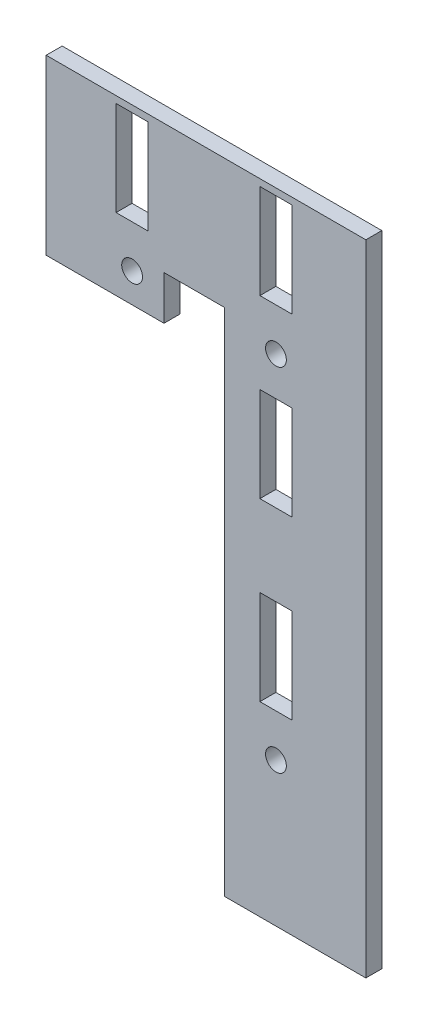
ISO-10303-21;
HEADER;
FILE_DESCRIPTION(('STEP AP214'),'2;1');
FILE_NAME('part.step','',(''),(''),'','','');
FILE_SCHEMA(('AUTOMOTIVE_DESIGN { 1 0 10303 214 1 1 1 1 }'));
ENDSEC;
DATA;
#1=APPLICATION_CONTEXT('core data for automotive mechanical design processes');
#2=APPLICATION_PROTOCOL_DEFINITION('international standard','automotive_design',2000,#1);
#3=PRODUCT_CONTEXT('',#1,'mechanical');
#4=PRODUCT('Part','Part','',(#3));
#5=PRODUCT_RELATED_PRODUCT_CATEGORY('part','',(#4));
#6=PRODUCT_DEFINITION_FORMATION('','',#4);
#7=PRODUCT_DEFINITION_CONTEXT('part definition',#1,'design');
#8=PRODUCT_DEFINITION('design','',#6,#7);
#9=PRODUCT_DEFINITION_SHAPE('','',#8);
#10=(LENGTH_UNIT() NAMED_UNIT(*) SI_UNIT(.MILLI.,.METRE.));
#11=(NAMED_UNIT(*) PLANE_ANGLE_UNIT() SI_UNIT($,.RADIAN.));
#12=(NAMED_UNIT(*) SI_UNIT($,.STERADIAN.) SOLID_ANGLE_UNIT());
#13=UNCERTAINTY_MEASURE_WITH_UNIT(LENGTH_MEASURE(1.E-05),#10,'distance_accuracy_value','');
#14=(GEOMETRIC_REPRESENTATION_CONTEXT(3) GLOBAL_UNCERTAINTY_ASSIGNED_CONTEXT((#13)) GLOBAL_UNIT_ASSIGNED_CONTEXT((#10,
#11,#12)) REPRESENTATION_CONTEXT('',''));
#15=CARTESIAN_POINT('',(0.,0.,0.));
#16=DIRECTION('',(0.,0.,1.));
#17=DIRECTION('',(1.,0.,0.));
#18=AXIS2_PLACEMENT_3D('',#15,#16,#17);
#19=CARTESIAN_POINT('',(-25.4,50.8,2.54));
#20=DIRECTION('',(0.,-1.,0.));
#21=DIRECTION('',(1.,0.,0.));
#22=AXIS2_PLACEMENT_3D('',#19,#20,#21);
#23=PLANE('',#22);
#24=DIRECTION('',(-1.,0.,0.));
#25=VECTOR('',#24,1.);
#26=CARTESIAN_POINT('',(-25.4,50.8,0.));
#27=LINE('',#26,#25);
#28=CARTESIAN_POINT('',(25.4,50.8,0.));
#29=VERTEX_POINT('',#28);
#30=CARTESIAN_POINT('',(-25.4,50.8,0.));
#31=VERTEX_POINT('',#30);
#32=EDGE_CURVE('E228',#29,#31,#27,.T.);
#33=ORIENTED_EDGE('',*,*,#32,.T.);
#34=DIRECTION('',(0.,0.,-1.));
#35=VECTOR('',#34,1.);
#36=CARTESIAN_POINT('',(-25.4,50.8,2.54));
#37=LINE('',#36,#35);
#38=CARTESIAN_POINT('',(-25.4,50.8,2.54));
#39=VERTEX_POINT('',#38);
#40=EDGE_CURVE('E11',#39,#31,#37,.T.);
#41=ORIENTED_EDGE('',*,*,#40,.F.);
#42=DIRECTION('',(-1.,0.,0.));
#43=VECTOR('',#42,1.);
#44=CARTESIAN_POINT('',(-25.4,50.8,2.54));
#45=LINE('',#44,#43);
#46=CARTESIAN_POINT('',(25.4,50.8,2.54));
#47=VERTEX_POINT('',#46);
#48=EDGE_CURVE('E225',#47,#39,#45,.T.);
#49=ORIENTED_EDGE('',*,*,#48,.F.);
#50=DIRECTION('',(0.,0.,-1.));
#51=VECTOR('',#50,1.);
#52=CARTESIAN_POINT('',(25.4,50.8,2.54));
#53=LINE('',#52,#51);
#54=EDGE_CURVE('E232',#47,#29,#53,.T.);
#55=ORIENTED_EDGE('',*,*,#54,.T.);
#56=EDGE_LOOP('',(#33,#41,#49,#55));
#57=FACE_BOUND('',#56,.T.);
#58=ADVANCED_FACE('F39',(#57),#23,.F.);
#59=CARTESIAN_POINT('',(-25.4,-50.8,2.54));
#60=DIRECTION('',(1.,0.,0.));
#61=DIRECTION('',(0.,0.,-1.));
#62=AXIS2_PLACEMENT_3D('',#59,#60,#61);
#63=PLANE('',#62);
#64=DIRECTION('',(0.,-1.,0.));
#65=VECTOR('',#64,1.);
#66=CARTESIAN_POINT('',(-25.4,-50.8,0.));
#67=LINE('',#66,#65);
#68=CARTESIAN_POINT('',(-25.4,23.27,0.));
#69=VERTEX_POINT('',#68);
#70=EDGE_CURVE('E223',#31,#69,#67,.T.);
#71=ORIENTED_EDGE('',*,*,#70,.T.);
#72=DIRECTION('',(0.,0.,1.));
#73=VECTOR('',#72,1.);
#74=CARTESIAN_POINT('',(-25.4,23.27,0.));
#75=LINE('',#74,#73);
#76=CARTESIAN_POINT('',(-25.4,23.27,2.54));
#77=VERTEX_POINT('',#76);
#78=EDGE_CURVE('E270',#69,#77,#75,.T.);
#79=ORIENTED_EDGE('',*,*,#78,.T.);
#80=DIRECTION('',(0.,-1.,0.));
#81=VECTOR('',#80,1.);
#82=CARTESIAN_POINT('',(-25.4,-50.8,2.54));
#83=LINE('',#82,#81);
#84=EDGE_CURVE('E243',#39,#77,#83,.T.);
#85=ORIENTED_EDGE('',*,*,#84,.F.);
#86=ORIENTED_EDGE('',*,*,#40,.T.);
#87=EDGE_LOOP('',(#71,#79,#85,#86));
#88=FACE_BOUND('',#87,.T.);
#89=ADVANCED_FACE('F269',(#88),#63,.F.);
#90=CARTESIAN_POINT('',(-25.4,-50.8,2.54));
#91=DIRECTION('',(0.,1.,0.));
#92=DIRECTION('',(-1.,0.,0.));
#93=AXIS2_PLACEMENT_3D('',#90,#91,#92);
#94=PLANE('',#93);
#95=DIRECTION('',(1.,0.,0.));
#96=VECTOR('',#95,1.);
#97=CARTESIAN_POINT('',(-25.4,-50.8,2.54));
#98=LINE('',#97,#96);
#99=CARTESIAN_POINT('',(2.97790303354134,-50.8,2.54));
#100=VERTEX_POINT('',#99);
#101=CARTESIAN_POINT('',(25.4,-50.8,2.54));
#102=VERTEX_POINT('',#101);
#103=EDGE_CURVE('E215',#100,#102,#98,.T.);
#104=ORIENTED_EDGE('',*,*,#103,.F.);
#105=DIRECTION('',(0.,0.,1.));
#106=VECTOR('',#105,1.);
#107=CARTESIAN_POINT('',(2.97790303354134,-50.8,0.));
#108=LINE('',#107,#106);
#109=CARTESIAN_POINT('',(2.97790303354134,-50.8,0.));
#110=VERTEX_POINT('',#109);
#111=EDGE_CURVE('E202',#110,#100,#108,.T.);
#112=ORIENTED_EDGE('',*,*,#111,.F.);
#113=DIRECTION('',(1.,0.,0.));
#114=VECTOR('',#113,1.);
#115=CARTESIAN_POINT('',(-25.4,-50.8,0.));
#116=LINE('',#115,#114);
#117=CARTESIAN_POINT('',(25.4,-50.8,0.));
#118=VERTEX_POINT('',#117);
#119=EDGE_CURVE('E213',#110,#118,#116,.T.);
#120=ORIENTED_EDGE('',*,*,#119,.T.);
#121=DIRECTION('',(0.,0.,-1.));
#122=VECTOR('',#121,1.);
#123=CARTESIAN_POINT('',(25.4,-50.8,2.54));
#124=LINE('',#123,#122);
#125=EDGE_CURVE('E46',#102,#118,#124,.T.);
#126=ORIENTED_EDGE('',*,*,#125,.F.);
#127=EDGE_LOOP('',(#104,#112,#120,#126));
#128=FACE_BOUND('',#127,.T.);
#129=ADVANCED_FACE('F211',(#128),#94,.F.);
#130=CARTESIAN_POINT('',(25.4,-50.8,2.54));
#131=DIRECTION('',(-1.,0.,0.));
#132=DIRECTION('',(0.,0.,1.));
#133=AXIS2_PLACEMENT_3D('',#130,#131,#132);
#134=PLANE('',#133);
#135=DIRECTION('',(0.,1.,0.));
#136=VECTOR('',#135,1.);
#137=CARTESIAN_POINT('',(25.4,-50.8,0.));
#138=LINE('',#137,#136);
#139=EDGE_CURVE('E222',#118,#29,#138,.T.);
#140=ORIENTED_EDGE('',*,*,#139,.T.);
#141=ORIENTED_EDGE('',*,*,#54,.F.);
#142=DIRECTION('',(0.,1.,0.));
#143=VECTOR('',#142,1.);
#144=CARTESIAN_POINT('',(25.4,-50.8,2.54));
#145=LINE('',#144,#143);
#146=EDGE_CURVE('E234',#102,#47,#145,.T.);
#147=ORIENTED_EDGE('',*,*,#146,.F.);
#148=ORIENTED_EDGE('',*,*,#125,.T.);
#149=EDGE_LOOP('',(#140,#141,#147,#148));
#150=FACE_BOUND('',#149,.T.);
#151=ADVANCED_FACE('F237',(#150),#134,.F.);
#152=CARTESIAN_POINT('',(0.,0.,2.54));
#153=DIRECTION('',(0.,0.,1.));
#154=DIRECTION('',(1.,0.,0.));
#155=AXIS2_PLACEMENT_3D('',#152,#153,#154);
#156=PLANE('',#155);
#157=DIRECTION('',(-1.,0.,0.));
#158=VECTOR('',#157,1.);
#159=CARTESIAN_POINT('',(-6.67409696645865,23.27,2.54));
#160=LINE('',#159,#158);
#161=CARTESIAN_POINT('',(-6.67409696645865,23.27,2.54));
#162=VERTEX_POINT('',#161);
#163=EDGE_CURVE('E207',#162,#77,#160,.T.);
#164=ORIENTED_EDGE('',*,*,#163,.F.);
#165=DIRECTION('',(0.,-1.,0.));
#166=VECTOR('',#165,1.);
#167=CARTESIAN_POINT('',(-6.67409696645865,30.255,2.54));
#168=LINE('',#167,#166);
#169=CARTESIAN_POINT('',(-6.67409696645865,30.255,2.54));
#170=VERTEX_POINT('',#169);
#171=EDGE_CURVE('E670',#170,#162,#168,.T.);
#172=ORIENTED_EDGE('',*,*,#171,.F.);
#173=DIRECTION('',(-1.,0.,0.));
#174=VECTOR('',#173,1.);
#175=CARTESIAN_POINT('',(2.97790303354134,30.255,2.54));
#176=LINE('',#175,#174);
#177=CARTESIAN_POINT('',(2.97790303354134,30.255,2.54));
#178=VERTEX_POINT('',#177);
#179=EDGE_CURVE('E668',#178,#170,#176,.T.);
#180=ORIENTED_EDGE('',*,*,#179,.F.);
#181=DIRECTION('',(0.,1.,0.));
#182=VECTOR('',#181,1.);
#183=CARTESIAN_POINT('',(2.97790303354134,-50.8,2.54));
#184=LINE('',#183,#182);
#185=EDGE_CURVE('E671',#100,#178,#184,.T.);
#186=ORIENTED_EDGE('',*,*,#185,.F.);
#187=ORIENTED_EDGE('',*,*,#103,.T.);
#188=ORIENTED_EDGE('',*,*,#146,.T.);
#189=ORIENTED_EDGE('',*,*,#48,.T.);
#190=ORIENTED_EDGE('',*,*,#84,.T.);
#191=EDGE_LOOP('',(#164,#172,#180,#186,#187,#188,#189,#190));
#192=FACE_BOUND('',#191,.T.);
#193=DIRECTION('',(0.,-1.,0.));
#194=VECTOR('',#193,1.);
#195=CARTESIAN_POINT('',(8.56590303354135,-6.16000000000001,2.54));
#196=LINE('',#195,#194);
#197=CARTESIAN_POINT('',(8.56590303354135,-6.16000000000001,2.54));
#198=VERTEX_POINT('',#197);
#199=CARTESIAN_POINT('',(8.56590303354135,-21.18,2.54));
#200=VERTEX_POINT('',#199);
#201=EDGE_CURVE('E61',#198,#200,#196,.T.);
#202=ORIENTED_EDGE('',*,*,#201,.F.);
#203=DIRECTION('',(-1.,0.,0.));
#204=VECTOR('',#203,1.);
#205=CARTESIAN_POINT('',(13.6659030335413,-6.16000000000001,2.54));
#206=LINE('',#205,#204);
#207=CARTESIAN_POINT('',(13.6659030335413,-6.16000000000001,2.54));
#208=VERTEX_POINT('',#207);
#209=EDGE_CURVE('E290',#208,#198,#206,.T.);
#210=ORIENTED_EDGE('',*,*,#209,.F.);
#211=DIRECTION('',(0.,1.,0.));
#212=VECTOR('',#211,1.);
#213=CARTESIAN_POINT('',(13.6659030335413,-6.16000000000001,2.54));
#214=LINE('',#213,#212);
#215=CARTESIAN_POINT('',(13.6659030335413,-21.18,2.54));
#216=VERTEX_POINT('',#215);
#217=EDGE_CURVE('E305',#216,#208,#214,.T.);
#218=ORIENTED_EDGE('',*,*,#217,.F.);
#219=DIRECTION('',(1.,0.,0.));
#220=VECTOR('',#219,1.);
#221=CARTESIAN_POINT('',(13.6659030335413,-21.18,2.54));
#222=LINE('',#221,#220);
#223=EDGE_CURVE('E301',#200,#216,#222,.T.);
#224=ORIENTED_EDGE('',*,*,#223,.F.);
#225=EDGE_LOOP('',(#202,#210,#218,#224));
#226=FACE_BOUND('',#225,.T.);
#227=DIRECTION('',(0.,1.,0.));
#228=VECTOR('',#227,1.);
#229=CARTESIAN_POINT('',(13.6659030335413,34.7,2.54));
#230=LINE('',#229,#228);
#231=CARTESIAN_POINT('',(13.6659030335413,34.7,2.54));
#232=VERTEX_POINT('',#231);
#233=CARTESIAN_POINT('',(13.6659030335413,49.72,2.54));
#234=VERTEX_POINT('',#233);
#235=EDGE_CURVE('E302',#232,#234,#230,.T.);
#236=ORIENTED_EDGE('',*,*,#235,.F.);
#237=DIRECTION('',(1.,0.,0.));
#238=VECTOR('',#237,1.);
#239=CARTESIAN_POINT('',(13.6659030335413,34.7,2.54));
#240=LINE('',#239,#238);
#241=CARTESIAN_POINT('',(8.56590303354134,34.7,2.54));
#242=VERTEX_POINT('',#241);
#243=EDGE_CURVE('E328',#242,#232,#240,.T.);
#244=ORIENTED_EDGE('',*,*,#243,.F.);
#245=DIRECTION('',(0.,-1.,0.));
#246=VECTOR('',#245,1.);
#247=CARTESIAN_POINT('',(8.56590303354134,34.7,2.54));
#248=LINE('',#247,#246);
#249=CARTESIAN_POINT('',(8.56590303354134,49.72,2.54));
#250=VERTEX_POINT('',#249);
#251=EDGE_CURVE('E331',#250,#242,#248,.T.);
#252=ORIENTED_EDGE('',*,*,#251,.F.);
#253=DIRECTION('',(-1.,0.,0.));
#254=VECTOR('',#253,1.);
#255=CARTESIAN_POINT('',(13.6659030335413,49.72,2.54));
#256=LINE('',#255,#254);
#257=EDGE_CURVE('E335',#234,#250,#256,.T.);
#258=ORIENTED_EDGE('',*,*,#257,.F.);
#259=EDGE_LOOP('',(#236,#244,#252,#258));
#260=FACE_BOUND('',#259,.T.);
#261=DIRECTION('',(0.,1.,0.));
#262=VECTOR('',#261,1.);
#263=CARTESIAN_POINT('',(13.6659030335413,6.76,2.54));
#264=LINE('',#263,#262);
#265=CARTESIAN_POINT('',(13.6659030335413,6.76,2.54));
#266=VERTEX_POINT('',#265);
#267=CARTESIAN_POINT('',(13.6659030335413,21.78,2.54));
#268=VERTEX_POINT('',#267);
#269=EDGE_CURVE('E327',#266,#268,#264,.T.);
#270=ORIENTED_EDGE('',*,*,#269,.F.);
#271=DIRECTION('',(1.,0.,0.));
#272=VECTOR('',#271,1.);
#273=CARTESIAN_POINT('',(13.6659030335413,6.76,2.54));
#274=LINE('',#273,#272);
#275=CARTESIAN_POINT('',(8.56590303354134,6.75999999999999,2.54));
#276=VERTEX_POINT('',#275);
#277=EDGE_CURVE('E360',#276,#266,#274,.T.);
#278=ORIENTED_EDGE('',*,*,#277,.F.);
#279=DIRECTION('',(0.,-1.,0.));
#280=VECTOR('',#279,1.);
#281=CARTESIAN_POINT('',(8.56590303354134,6.75999999999999,2.54));
#282=LINE('',#281,#280);
#283=CARTESIAN_POINT('',(8.56590303354134,21.78,2.54));
#284=VERTEX_POINT('',#283);
#285=EDGE_CURVE('E363',#284,#276,#282,.T.);
#286=ORIENTED_EDGE('',*,*,#285,.F.);
#287=DIRECTION('',(-1.,0.,0.));
#288=VECTOR('',#287,1.);
#289=CARTESIAN_POINT('',(13.6659030335413,21.78,2.54));
#290=LINE('',#289,#288);
#291=EDGE_CURVE('E367',#268,#284,#290,.T.);
#292=ORIENTED_EDGE('',*,*,#291,.F.);
#293=EDGE_LOOP('',(#270,#278,#286,#292));
#294=FACE_BOUND('',#293,.T.);
#295=DIRECTION('',(0.,1.,0.));
#296=VECTOR('',#295,1.);
#297=CARTESIAN_POINT('',(-9.19409696645866,34.7,2.54));
#298=LINE('',#297,#296);
#299=CARTESIAN_POINT('',(-9.19409696645866,34.7,2.54));
#300=VERTEX_POINT('',#299);
#301=CARTESIAN_POINT('',(-9.19409696645866,49.72,2.54));
#302=VERTEX_POINT('',#301);
#303=EDGE_CURVE('E359',#300,#302,#298,.T.);
#304=ORIENTED_EDGE('',*,*,#303,.F.);
#305=DIRECTION('',(1.,0.,0.));
#306=VECTOR('',#305,1.);
#307=CARTESIAN_POINT('',(-9.19409696645866,34.7,2.54));
#308=LINE('',#307,#306);
#309=CARTESIAN_POINT('',(-14.2940969664587,34.7,2.54));
#310=VERTEX_POINT('',#309);
#311=EDGE_CURVE('E388',#310,#300,#308,.T.);
#312=ORIENTED_EDGE('',*,*,#311,.F.);
#313=DIRECTION('',(0.,-1.,0.));
#314=VECTOR('',#313,1.);
#315=CARTESIAN_POINT('',(-14.2940969664587,34.7,2.54));
#316=LINE('',#315,#314);
#317=CARTESIAN_POINT('',(-14.2940969664587,49.72,2.54));
#318=VERTEX_POINT('',#317);
#319=EDGE_CURVE('E391',#318,#310,#316,.T.);
#320=ORIENTED_EDGE('',*,*,#319,.F.);
#321=DIRECTION('',(-1.,0.,0.));
#322=VECTOR('',#321,1.);
#323=CARTESIAN_POINT('',(-9.19409696645866,49.72,2.54));
#324=LINE('',#323,#322);
#325=EDGE_CURVE('E395',#302,#318,#324,.T.);
#326=ORIENTED_EDGE('',*,*,#325,.F.);
#327=EDGE_LOOP('',(#304,#312,#320,#326));
#328=FACE_BOUND('',#327,.T.);
#329=CARTESIAN_POINT('',(-11.7440969664587,27.94,2.54));
#330=DIRECTION('',(0.,0.,1.));
#331=DIRECTION('',(1.,0.,0.));
#332=AXIS2_PLACEMENT_3D('',#329,#330,#331);
#333=CIRCLE('',#332,1.651);
#334=CARTESIAN_POINT('',(-10.0930969664587,27.94,2.54));
#335=VERTEX_POINT('',#334);
#336=EDGE_CURVE('E413',#335,#335,#333,.T.);
#337=ORIENTED_EDGE('',*,*,#336,.F.);
#338=EDGE_LOOP('',(#337));
#339=FACE_BOUND('',#338,.T.);
#340=CARTESIAN_POINT('',(11.1159030335413,-27.94,2.54));
#341=DIRECTION('',(0.,0.,1.));
#342=DIRECTION('',(1.,0.,0.));
#343=AXIS2_PLACEMENT_3D('',#340,#341,#342);
#344=CIRCLE('',#343,1.651);
#345=CARTESIAN_POINT('',(12.7669030335413,-27.94,2.54));
#346=VERTEX_POINT('',#345);
#347=EDGE_CURVE('E256',#346,#346,#344,.T.);
#348=ORIENTED_EDGE('',*,*,#347,.F.);
#349=EDGE_LOOP('',(#348));
#350=FACE_BOUND('',#349,.T.);
#351=CARTESIAN_POINT('',(11.1159030335413,27.94,2.54));
#352=DIRECTION('',(0.,0.,1.));
#353=DIRECTION('',(1.,0.,0.));
#354=AXIS2_PLACEMENT_3D('',#351,#352,#353);
#355=CIRCLE('',#354,1.651);
#356=CARTESIAN_POINT('',(12.7669030335413,27.94,2.54));
#357=VERTEX_POINT('',#356);
#358=EDGE_CURVE('E251',#357,#357,#355,.T.);
#359=ORIENTED_EDGE('',*,*,#358,.F.);
#360=EDGE_LOOP('',(#359));
#361=FACE_BOUND('',#360,.T.);
#362=ADVANCED_FACE('F264',(#192,#226,#260,#294,#328,#339,#350,#361),#156,.T.);
#363=CARTESIAN_POINT('',(0.,0.,0.));
#364=DIRECTION('',(0.,0.,1.));
#365=DIRECTION('',(1.,0.,0.));
#366=AXIS2_PLACEMENT_3D('',#363,#364,#365);
#367=PLANE('',#366);
#368=DIRECTION('',(-1.,0.,0.));
#369=VECTOR('',#368,1.);
#370=CARTESIAN_POINT('',(13.6659030335413,-6.16000000000001,0.));
#371=LINE('',#370,#369);
#372=CARTESIAN_POINT('',(13.6659030335413,-6.16000000000001,0.));
#373=VERTEX_POINT('',#372);
#374=CARTESIAN_POINT('',(8.56590303354135,-6.16000000000001,0.));
#375=VERTEX_POINT('',#374);
#376=EDGE_CURVE('E296',#373,#375,#371,.T.);
#377=ORIENTED_EDGE('',*,*,#376,.T.);
#378=DIRECTION('',(0.,-1.,0.));
#379=VECTOR('',#378,1.);
#380=CARTESIAN_POINT('',(8.56590303354135,-6.16000000000001,0.));
#381=LINE('',#380,#379);
#382=CARTESIAN_POINT('',(8.56590303354135,-21.18,0.));
#383=VERTEX_POINT('',#382);
#384=EDGE_CURVE('E286',#375,#383,#381,.T.);
#385=ORIENTED_EDGE('',*,*,#384,.T.);
#386=DIRECTION('',(1.,0.,0.));
#387=VECTOR('',#386,1.);
#388=CARTESIAN_POINT('',(13.6659030335413,-21.18,0.));
#389=LINE('',#388,#387);
#390=CARTESIAN_POINT('',(13.6659030335413,-21.18,0.));
#391=VERTEX_POINT('',#390);
#392=EDGE_CURVE('E289',#383,#391,#389,.T.);
#393=ORIENTED_EDGE('',*,*,#392,.T.);
#394=DIRECTION('',(0.,1.,0.));
#395=VECTOR('',#394,1.);
#396=CARTESIAN_POINT('',(13.6659030335413,-6.16000000000001,0.));
#397=LINE('',#396,#395);
#398=EDGE_CURVE('E293',#391,#373,#397,.T.);
#399=ORIENTED_EDGE('',*,*,#398,.T.);
#400=EDGE_LOOP('',(#377,#385,#393,#399));
#401=FACE_BOUND('',#400,.T.);
#402=DIRECTION('',(1.,0.,0.));
#403=VECTOR('',#402,1.);
#404=CARTESIAN_POINT('',(13.6659030335413,34.7,0.));
#405=LINE('',#404,#403);
#406=CARTESIAN_POINT('',(8.56590303354134,34.7,0.));
#407=VERTEX_POINT('',#406);
#408=CARTESIAN_POINT('',(13.6659030335413,34.7,0.));
#409=VERTEX_POINT('',#408);
#410=EDGE_CURVE('E320',#407,#409,#405,.T.);
#411=ORIENTED_EDGE('',*,*,#410,.T.);
#412=DIRECTION('',(0.,1.,0.));
#413=VECTOR('',#412,1.);
#414=CARTESIAN_POINT('',(13.6659030335413,34.7,0.));
#415=LINE('',#414,#413);
#416=CARTESIAN_POINT('',(13.6659030335413,49.72,0.));
#417=VERTEX_POINT('',#416);
#418=EDGE_CURVE('E332',#409,#417,#415,.T.);
#419=ORIENTED_EDGE('',*,*,#418,.T.);
#420=DIRECTION('',(-1.,0.,0.));
#421=VECTOR('',#420,1.);
#422=CARTESIAN_POINT('',(13.6659030335413,49.72,0.));
#423=LINE('',#422,#421);
#424=CARTESIAN_POINT('',(8.56590303354134,49.72,0.));
#425=VERTEX_POINT('',#424);
#426=EDGE_CURVE('E344',#417,#425,#423,.T.);
#427=ORIENTED_EDGE('',*,*,#426,.T.);
#428=DIRECTION('',(0.,-1.,0.));
#429=VECTOR('',#428,1.);
#430=CARTESIAN_POINT('',(8.56590303354134,34.7,0.));
#431=LINE('',#430,#429);
#432=EDGE_CURVE('E341',#425,#407,#431,.T.);
#433=ORIENTED_EDGE('',*,*,#432,.T.);
#434=EDGE_LOOP('',(#411,#419,#427,#433));
#435=FACE_BOUND('',#434,.T.);
#436=DIRECTION('',(1.,0.,0.));
#437=VECTOR('',#436,1.);
#438=CARTESIAN_POINT('',(13.6659030335413,6.76,0.));
#439=LINE('',#438,#437);
#440=CARTESIAN_POINT('',(8.56590303354134,6.75999999999999,0.));
#441=VERTEX_POINT('',#440);
#442=CARTESIAN_POINT('',(13.6659030335413,6.76,0.));
#443=VERTEX_POINT('',#442);
#444=EDGE_CURVE('E352',#441,#443,#439,.T.);
#445=ORIENTED_EDGE('',*,*,#444,.T.);
#446=DIRECTION('',(0.,1.,0.));
#447=VECTOR('',#446,1.);
#448=CARTESIAN_POINT('',(13.6659030335413,6.76,0.));
#449=LINE('',#448,#447);
#450=CARTESIAN_POINT('',(13.6659030335413,21.78,0.));
#451=VERTEX_POINT('',#450);
#452=EDGE_CURVE('E364',#443,#451,#449,.T.);
#453=ORIENTED_EDGE('',*,*,#452,.T.);
#454=DIRECTION('',(-1.,0.,0.));
#455=VECTOR('',#454,1.);
#456=CARTESIAN_POINT('',(13.6659030335413,21.78,0.));
#457=LINE('',#456,#455);
#458=CARTESIAN_POINT('',(8.56590303354134,21.78,0.));
#459=VERTEX_POINT('',#458);
#460=EDGE_CURVE('E376',#451,#459,#457,.T.);
#461=ORIENTED_EDGE('',*,*,#460,.T.);
#462=DIRECTION('',(0.,-1.,0.));
#463=VECTOR('',#462,1.);
#464=CARTESIAN_POINT('',(8.56590303354134,6.75999999999999,0.));
#465=LINE('',#464,#463);
#466=EDGE_CURVE('E373',#459,#441,#465,.T.);
#467=ORIENTED_EDGE('',*,*,#466,.T.);
#468=EDGE_LOOP('',(#445,#453,#461,#467));
#469=FACE_BOUND('',#468,.T.);
#470=DIRECTION('',(1.,0.,0.));
#471=VECTOR('',#470,1.);
#472=CARTESIAN_POINT('',(-9.19409696645866,34.7,0.));
#473=LINE('',#472,#471);
#474=CARTESIAN_POINT('',(-14.2940969664587,34.7,0.));
#475=VERTEX_POINT('',#474);
#476=CARTESIAN_POINT('',(-9.19409696645866,34.7,0.));
#477=VERTEX_POINT('',#476);
#478=EDGE_CURVE('E384',#475,#477,#473,.T.);
#479=ORIENTED_EDGE('',*,*,#478,.T.);
#480=DIRECTION('',(0.,1.,0.));
#481=VECTOR('',#480,1.);
#482=CARTESIAN_POINT('',(-9.19409696645866,34.7,0.));
#483=LINE('',#482,#481);
#484=CARTESIAN_POINT('',(-9.19409696645866,49.72,0.));
#485=VERTEX_POINT('',#484);
#486=EDGE_CURVE('E392',#477,#485,#483,.T.);
#487=ORIENTED_EDGE('',*,*,#486,.T.);
#488=DIRECTION('',(-1.,0.,0.));
#489=VECTOR('',#488,1.);
#490=CARTESIAN_POINT('',(-9.19409696645866,49.72,0.));
#491=LINE('',#490,#489);
#492=CARTESIAN_POINT('',(-14.2940969664587,49.72,0.));
#493=VERTEX_POINT('',#492);
#494=EDGE_CURVE('E404',#485,#493,#491,.T.);
#495=ORIENTED_EDGE('',*,*,#494,.T.);
#496=DIRECTION('',(0.,-1.,0.));
#497=VECTOR('',#496,1.);
#498=CARTESIAN_POINT('',(-14.2940969664587,34.7,0.));
#499=LINE('',#498,#497);
#500=EDGE_CURVE('E401',#493,#475,#499,.T.);
#501=ORIENTED_EDGE('',*,*,#500,.T.);
#502=EDGE_LOOP('',(#479,#487,#495,#501));
#503=FACE_BOUND('',#502,.T.);
#504=CARTESIAN_POINT('',(-11.7440969664587,27.94,0.));
#505=DIRECTION('',(0.,0.,1.));
#506=DIRECTION('',(1.,0.,0.));
#507=AXIS2_PLACEMENT_3D('',#504,#505,#506);
#508=CIRCLE('',#507,1.651);
#509=CARTESIAN_POINT('',(-10.0930969664587,27.94,0.));
#510=VERTEX_POINT('',#509);
#511=EDGE_CURVE('E259',#510,#510,#508,.T.);
#512=ORIENTED_EDGE('',*,*,#511,.T.);
#513=EDGE_LOOP('',(#512));
#514=FACE_BOUND('',#513,.T.);
#515=CARTESIAN_POINT('',(11.1159030335413,-27.94,0.));
#516=DIRECTION('',(0.,0.,1.));
#517=DIRECTION('',(1.,0.,0.));
#518=AXIS2_PLACEMENT_3D('',#515,#516,#517);
#519=CIRCLE('',#518,1.651);
#520=CARTESIAN_POINT('',(12.7669030335413,-27.94,0.));
#521=VERTEX_POINT('',#520);
#522=EDGE_CURVE('E411',#521,#521,#519,.T.);
#523=ORIENTED_EDGE('',*,*,#522,.T.);
#524=EDGE_LOOP('',(#523));
#525=FACE_BOUND('',#524,.T.);
#526=CARTESIAN_POINT('',(11.1159030335413,27.94,0.));
#527=DIRECTION('',(0.,0.,1.));
#528=DIRECTION('',(1.,0.,0.));
#529=AXIS2_PLACEMENT_3D('',#526,#527,#528);
#530=CIRCLE('',#529,1.651);
#531=CARTESIAN_POINT('',(12.7669030335413,27.94,0.));
#532=VERTEX_POINT('',#531);
#533=EDGE_CURVE('E247',#532,#532,#530,.T.);
#534=ORIENTED_EDGE('',*,*,#533,.T.);
#535=EDGE_LOOP('',(#534));
#536=FACE_BOUND('',#535,.T.);
#537=DIRECTION('',(0.,-1.,0.));
#538=VECTOR('',#537,1.);
#539=CARTESIAN_POINT('',(-6.67409696645865,30.255,0.));
#540=LINE('',#539,#538);
#541=CARTESIAN_POINT('',(-6.67409696645865,30.255,0.));
#542=VERTEX_POINT('',#541);
#543=CARTESIAN_POINT('',(-6.67409696645865,23.27,0.));
#544=VERTEX_POINT('',#543);
#545=EDGE_CURVE('E677',#542,#544,#540,.T.);
#546=ORIENTED_EDGE('',*,*,#545,.T.);
#547=DIRECTION('',(-1.,0.,0.));
#548=VECTOR('',#547,1.);
#549=CARTESIAN_POINT('',(-6.67409696645865,23.27,0.));
#550=LINE('',#549,#548);
#551=EDGE_CURVE('E216',#544,#69,#550,.T.);
#552=ORIENTED_EDGE('',*,*,#551,.T.);
#553=ORIENTED_EDGE('',*,*,#70,.F.);
#554=ORIENTED_EDGE('',*,*,#32,.F.);
#555=ORIENTED_EDGE('',*,*,#139,.F.);
#556=ORIENTED_EDGE('',*,*,#119,.F.);
#557=DIRECTION('',(0.,1.,0.));
#558=VECTOR('',#557,1.);
#559=CARTESIAN_POINT('',(2.97790303354134,-50.8,0.));
#560=LINE('',#559,#558);
#561=CARTESIAN_POINT('',(2.97790303354134,30.255,0.));
#562=VERTEX_POINT('',#561);
#563=EDGE_CURVE('E198',#110,#562,#560,.T.);
#564=ORIENTED_EDGE('',*,*,#563,.T.);
#565=DIRECTION('',(-1.,0.,0.));
#566=VECTOR('',#565,1.);
#567=CARTESIAN_POINT('',(2.97790303354134,30.255,0.));
#568=LINE('',#567,#566);
#569=EDGE_CURVE('E53',#562,#542,#568,.T.);
#570=ORIENTED_EDGE('',*,*,#569,.T.);
#571=EDGE_LOOP('',(#546,#552,#553,#554,#555,#556,#564,#570));
#572=FACE_BOUND('',#571,.T.);
#573=ADVANCED_FACE('F220',(#401,#435,#469,#503,#514,#525,#536,#572),#367,.F.);
#574=CARTESIAN_POINT('',(11.1159030335413,27.94,0.));
#575=DIRECTION('',(0.,0.,1.));
#576=DIRECTION('',(1.,0.,0.));
#577=AXIS2_PLACEMENT_3D('',#574,#575,#576);
#578=CYLINDRICAL_SURFACE('',#577,1.651);
#579=ORIENTED_EDGE('',*,*,#533,.F.);
#580=EDGE_LOOP('',(#579));
#581=FACE_BOUND('',#580,.T.);
#582=ORIENTED_EDGE('',*,*,#358,.T.);
#583=EDGE_LOOP('',(#582));
#584=FACE_BOUND('',#583,.T.);
#585=ADVANCED_FACE('F434',(#581,#584),#578,.F.);
#586=CARTESIAN_POINT('',(11.1159030335413,-27.94,0.));
#587=DIRECTION('',(0.,0.,1.));
#588=DIRECTION('',(1.,0.,0.));
#589=AXIS2_PLACEMENT_3D('',#586,#587,#588);
#590=CYLINDRICAL_SURFACE('',#589,1.651);
#591=ORIENTED_EDGE('',*,*,#522,.F.);
#592=EDGE_LOOP('',(#591));
#593=FACE_BOUND('',#592,.T.);
#594=ORIENTED_EDGE('',*,*,#347,.T.);
#595=EDGE_LOOP('',(#594));
#596=FACE_BOUND('',#595,.T.);
#597=ADVANCED_FACE('F425',(#593,#596),#590,.F.);
#598=CARTESIAN_POINT('',(-11.7440969664587,27.94,0.));
#599=DIRECTION('',(0.,0.,1.));
#600=DIRECTION('',(1.,0.,0.));
#601=AXIS2_PLACEMENT_3D('',#598,#599,#600);
#602=CYLINDRICAL_SURFACE('',#601,1.651);
#603=ORIENTED_EDGE('',*,*,#511,.F.);
#604=EDGE_LOOP('',(#603));
#605=FACE_BOUND('',#604,.T.);
#606=ORIENTED_EDGE('',*,*,#336,.T.);
#607=EDGE_LOOP('',(#606));
#608=FACE_BOUND('',#607,.T.);
#609=ADVANCED_FACE('F422',(#605,#608),#602,.F.);
#610=CARTESIAN_POINT('',(-9.19409696645866,34.7,0.));
#611=DIRECTION('',(1.,0.,0.));
#612=DIRECTION('',(0.,0.,-1.));
#613=AXIS2_PLACEMENT_3D('',#610,#611,#612);
#614=PLANE('',#613);
#615=ORIENTED_EDGE('',*,*,#303,.T.);
#616=DIRECTION('',(0.,0.,1.));
#617=VECTOR('',#616,1.);
#618=CARTESIAN_POINT('',(-9.19409696645866,49.72,0.));
#619=LINE('',#618,#617);
#620=EDGE_CURVE('E381',#485,#302,#619,.T.);
#621=ORIENTED_EDGE('',*,*,#620,.F.);
#622=ORIENTED_EDGE('',*,*,#486,.F.);
#623=DIRECTION('',(0.,0.,1.));
#624=VECTOR('',#623,1.);
#625=CARTESIAN_POINT('',(-9.19409696645866,34.7,0.));
#626=LINE('',#625,#624);
#627=EDGE_CURVE('E274',#477,#300,#626,.T.);
#628=ORIENTED_EDGE('',*,*,#627,.T.);
#629=EDGE_LOOP('',(#615,#621,#622,#628));
#630=FACE_BOUND('',#629,.T.);
#631=ADVANCED_FACE('F424',(#630),#614,.F.);
#632=CARTESIAN_POINT('',(-9.19409696645866,34.7,0.));
#633=DIRECTION('',(0.,-1.,0.));
#634=DIRECTION('',(1.,0.,0.));
#635=AXIS2_PLACEMENT_3D('',#632,#633,#634);
#636=PLANE('',#635);
#637=ORIENTED_EDGE('',*,*,#311,.T.);
#638=ORIENTED_EDGE('',*,*,#627,.F.);
#639=ORIENTED_EDGE('',*,*,#478,.F.);
#640=DIRECTION('',(0.,0.,1.));
#641=VECTOR('',#640,1.);
#642=CARTESIAN_POINT('',(-14.2940969664587,34.7,0.));
#643=LINE('',#642,#641);
#644=EDGE_CURVE('E277',#475,#310,#643,.T.);
#645=ORIENTED_EDGE('',*,*,#644,.T.);
#646=EDGE_LOOP('',(#637,#638,#639,#645));
#647=FACE_BOUND('',#646,.T.);
#648=ADVANCED_FACE('F431',(#647),#636,.F.);
#649=CARTESIAN_POINT('',(-14.2940969664587,34.7,0.));
#650=DIRECTION('',(-1.,0.,0.));
#651=DIRECTION('',(0.,0.,1.));
#652=AXIS2_PLACEMENT_3D('',#649,#650,#651);
#653=PLANE('',#652);
#654=ORIENTED_EDGE('',*,*,#319,.T.);
#655=ORIENTED_EDGE('',*,*,#644,.F.);
#656=ORIENTED_EDGE('',*,*,#500,.F.);
#657=DIRECTION('',(0.,0.,1.));
#658=VECTOR('',#657,1.);
#659=CARTESIAN_POINT('',(-14.2940969664587,49.72,0.));
#660=LINE('',#659,#658);
#661=EDGE_CURVE('E385',#493,#318,#660,.T.);
#662=ORIENTED_EDGE('',*,*,#661,.T.);
#663=EDGE_LOOP('',(#654,#655,#656,#662));
#664=FACE_BOUND('',#663,.T.);
#665=ADVANCED_FACE('F489',(#664),#653,.F.);
#666=CARTESIAN_POINT('',(-9.19409696645866,49.72,0.));
#667=DIRECTION('',(0.,1.,0.));
#668=DIRECTION('',(-1.,0.,0.));
#669=AXIS2_PLACEMENT_3D('',#666,#667,#668);
#670=PLANE('',#669);
#671=ORIENTED_EDGE('',*,*,#325,.T.);
#672=ORIENTED_EDGE('',*,*,#661,.F.);
#673=ORIENTED_EDGE('',*,*,#494,.F.);
#674=ORIENTED_EDGE('',*,*,#620,.T.);
#675=EDGE_LOOP('',(#671,#672,#673,#674));
#676=FACE_BOUND('',#675,.T.);
#677=ADVANCED_FACE('F499',(#676),#670,.F.);
#678=CARTESIAN_POINT('',(13.6659030335413,6.76,0.));
#679=DIRECTION('',(1.,0.,0.));
#680=DIRECTION('',(0.,1.,0.));
#681=AXIS2_PLACEMENT_3D('',#678,#679,#680);
#682=PLANE('',#681);
#683=ORIENTED_EDGE('',*,*,#269,.T.);
#684=DIRECTION('',(0.,0.,1.));
#685=VECTOR('',#684,1.);
#686=CARTESIAN_POINT('',(13.6659030335413,21.78,0.));
#687=LINE('',#686,#685);
#688=EDGE_CURVE('E349',#451,#268,#687,.T.);
#689=ORIENTED_EDGE('',*,*,#688,.F.);
#690=ORIENTED_EDGE('',*,*,#452,.F.);
#691=DIRECTION('',(0.,0.,1.));
#692=VECTOR('',#691,1.);
#693=CARTESIAN_POINT('',(13.6659030335413,6.76,0.));
#694=LINE('',#693,#692);
#695=EDGE_CURVE('E357',#443,#266,#694,.T.);
#696=ORIENTED_EDGE('',*,*,#695,.T.);
#697=EDGE_LOOP('',(#683,#689,#690,#696));
#698=FACE_BOUND('',#697,.T.);
#699=ADVANCED_FACE('F509',(#698),#682,.F.);
#700=CARTESIAN_POINT('',(13.6659030335413,6.76,0.));
#701=DIRECTION('',(0.,-1.,0.));
#702=DIRECTION('',(1.,0.,0.));
#703=AXIS2_PLACEMENT_3D('',#700,#701,#702);
#704=PLANE('',#703);
#705=ORIENTED_EDGE('',*,*,#277,.T.);
#706=ORIENTED_EDGE('',*,*,#695,.F.);
#707=ORIENTED_EDGE('',*,*,#444,.F.);
#708=DIRECTION('',(0.,0.,1.));
#709=VECTOR('',#708,1.);
#710=CARTESIAN_POINT('',(8.56590303354134,6.75999999999999,0.));
#711=LINE('',#710,#709);
#712=EDGE_CURVE('E355',#441,#276,#711,.T.);
#713=ORIENTED_EDGE('',*,*,#712,.T.);
#714=EDGE_LOOP('',(#705,#706,#707,#713));
#715=FACE_BOUND('',#714,.T.);
#716=ADVANCED_FACE('F519',(#715),#704,.F.);
#717=CARTESIAN_POINT('',(8.56590303354134,6.75999999999999,0.));
#718=DIRECTION('',(-1.,0.,0.));
#719=DIRECTION('',(0.,0.,1.));
#720=AXIS2_PLACEMENT_3D('',#717,#718,#719);
#721=PLANE('',#720);
#722=ORIENTED_EDGE('',*,*,#285,.T.);
#723=ORIENTED_EDGE('',*,*,#712,.F.);
#724=ORIENTED_EDGE('',*,*,#466,.F.);
#725=DIRECTION('',(0.,0.,1.));
#726=VECTOR('',#725,1.);
#727=CARTESIAN_POINT('',(8.56590303354134,21.78,0.));
#728=LINE('',#727,#726);
#729=EDGE_CURVE('E353',#459,#284,#728,.T.);
#730=ORIENTED_EDGE('',*,*,#729,.T.);
#731=EDGE_LOOP('',(#722,#723,#724,#730));
#732=FACE_BOUND('',#731,.T.);
#733=ADVANCED_FACE('F529',(#732),#721,.F.);
#734=CARTESIAN_POINT('',(13.6659030335413,21.78,0.));
#735=DIRECTION('',(0.,1.,0.));
#736=DIRECTION('',(0.,0.,1.));
#737=AXIS2_PLACEMENT_3D('',#734,#735,#736);
#738=PLANE('',#737);
#739=ORIENTED_EDGE('',*,*,#291,.T.);
#740=ORIENTED_EDGE('',*,*,#729,.F.);
#741=ORIENTED_EDGE('',*,*,#460,.F.);
#742=ORIENTED_EDGE('',*,*,#688,.T.);
#743=EDGE_LOOP('',(#739,#740,#741,#742));
#744=FACE_BOUND('',#743,.T.);
#745=ADVANCED_FACE('F539',(#744),#738,.F.);
#746=CARTESIAN_POINT('',(13.6659030335413,34.7,0.));
#747=DIRECTION('',(1.,0.,0.));
#748=DIRECTION('',(0.,1.,0.));
#749=AXIS2_PLACEMENT_3D('',#746,#747,#748);
#750=PLANE('',#749);
#751=ORIENTED_EDGE('',*,*,#235,.T.);
#752=DIRECTION('',(0.,0.,1.));
#753=VECTOR('',#752,1.);
#754=CARTESIAN_POINT('',(13.6659030335413,49.72,0.));
#755=LINE('',#754,#753);
#756=EDGE_CURVE('E317',#417,#234,#755,.T.);
#757=ORIENTED_EDGE('',*,*,#756,.F.);
#758=ORIENTED_EDGE('',*,*,#418,.F.);
#759=DIRECTION('',(0.,0.,1.));
#760=VECTOR('',#759,1.);
#761=CARTESIAN_POINT('',(13.6659030335413,34.7,0.));
#762=LINE('',#761,#760);
#763=EDGE_CURVE('E325',#409,#232,#762,.T.);
#764=ORIENTED_EDGE('',*,*,#763,.T.);
#765=EDGE_LOOP('',(#751,#757,#758,#764));
#766=FACE_BOUND('',#765,.T.);
#767=ADVANCED_FACE('F549',(#766),#750,.F.);
#768=CARTESIAN_POINT('',(13.6659030335413,34.7,0.));
#769=DIRECTION('',(0.,-1.,0.));
#770=DIRECTION('',(1.,0.,0.));
#771=AXIS2_PLACEMENT_3D('',#768,#769,#770);
#772=PLANE('',#771);
#773=ORIENTED_EDGE('',*,*,#243,.T.);
#774=ORIENTED_EDGE('',*,*,#763,.F.);
#775=ORIENTED_EDGE('',*,*,#410,.F.);
#776=DIRECTION('',(0.,0.,1.));
#777=VECTOR('',#776,1.);
#778=CARTESIAN_POINT('',(8.56590303354134,34.7,0.));
#779=LINE('',#778,#777);
#780=EDGE_CURVE('E323',#407,#242,#779,.T.);
#781=ORIENTED_EDGE('',*,*,#780,.T.);
#782=EDGE_LOOP('',(#773,#774,#775,#781));
#783=FACE_BOUND('',#782,.T.);
#784=ADVANCED_FACE('F559',(#783),#772,.F.);
#785=CARTESIAN_POINT('',(8.56590303354134,34.7,0.));
#786=DIRECTION('',(-1.,0.,0.));
#787=DIRECTION('',(0.,0.,1.));
#788=AXIS2_PLACEMENT_3D('',#785,#786,#787);
#789=PLANE('',#788);
#790=ORIENTED_EDGE('',*,*,#251,.T.);
#791=ORIENTED_EDGE('',*,*,#780,.F.);
#792=ORIENTED_EDGE('',*,*,#432,.F.);
#793=DIRECTION('',(0.,0.,1.));
#794=VECTOR('',#793,1.);
#795=CARTESIAN_POINT('',(8.56590303354134,49.72,0.));
#796=LINE('',#795,#794);
#797=EDGE_CURVE('E321',#425,#250,#796,.T.);
#798=ORIENTED_EDGE('',*,*,#797,.T.);
#799=EDGE_LOOP('',(#790,#791,#792,#798));
#800=FACE_BOUND('',#799,.T.);
#801=ADVANCED_FACE('F569',(#800),#789,.F.);
#802=CARTESIAN_POINT('',(13.6659030335413,49.72,0.));
#803=DIRECTION('',(0.,1.,0.));
#804=DIRECTION('',(0.,0.,1.));
#805=AXIS2_PLACEMENT_3D('',#802,#803,#804);
#806=PLANE('',#805);
#807=ORIENTED_EDGE('',*,*,#257,.T.);
#808=ORIENTED_EDGE('',*,*,#797,.F.);
#809=ORIENTED_EDGE('',*,*,#426,.F.);
#810=ORIENTED_EDGE('',*,*,#756,.T.);
#811=EDGE_LOOP('',(#807,#808,#809,#810));
#812=FACE_BOUND('',#811,.T.);
#813=ADVANCED_FACE('F579',(#812),#806,.F.);
#814=CARTESIAN_POINT('',(8.56590303354135,-6.16000000000001,0.));
#815=DIRECTION('',(-1.,0.,0.));
#816=DIRECTION('',(0.,-1.,0.));
#817=AXIS2_PLACEMENT_3D('',#814,#815,#816);
#818=PLANE('',#817);
#819=ORIENTED_EDGE('',*,*,#201,.T.);
#820=DIRECTION('',(0.,0.,1.));
#821=VECTOR('',#820,1.);
#822=CARTESIAN_POINT('',(8.56590303354135,-21.18,0.));
#823=LINE('',#822,#821);
#824=EDGE_CURVE('E299',#383,#200,#823,.T.);
#825=ORIENTED_EDGE('',*,*,#824,.F.);
#826=ORIENTED_EDGE('',*,*,#384,.F.);
#827=DIRECTION('',(0.,0.,1.));
#828=VECTOR('',#827,1.);
#829=CARTESIAN_POINT('',(8.56590303354135,-6.16000000000001,0.));
#830=LINE('',#829,#828);
#831=EDGE_CURVE('E310',#375,#198,#830,.T.);
#832=ORIENTED_EDGE('',*,*,#831,.T.);
#833=EDGE_LOOP('',(#819,#825,#826,#832));
#834=FACE_BOUND('',#833,.T.);
#835=ADVANCED_FACE('F589',(#834),#818,.F.);
#836=CARTESIAN_POINT('',(13.6659030335413,-6.16000000000001,0.));
#837=DIRECTION('',(0.,1.,0.));
#838=DIRECTION('',(-1.,0.,0.));
#839=AXIS2_PLACEMENT_3D('',#836,#837,#838);
#840=PLANE('',#839);
#841=ORIENTED_EDGE('',*,*,#209,.T.);
#842=ORIENTED_EDGE('',*,*,#831,.F.);
#843=ORIENTED_EDGE('',*,*,#376,.F.);
#844=DIRECTION('',(0.,0.,1.));
#845=VECTOR('',#844,1.);
#846=CARTESIAN_POINT('',(13.6659030335413,-6.16000000000001,0.));
#847=LINE('',#846,#845);
#848=EDGE_CURVE('E312',#373,#208,#847,.T.);
#849=ORIENTED_EDGE('',*,*,#848,.T.);
#850=EDGE_LOOP('',(#841,#842,#843,#849));
#851=FACE_BOUND('',#850,.T.);
#852=ADVANCED_FACE('F599',(#851),#840,.F.);
#853=CARTESIAN_POINT('',(13.6659030335413,-6.16000000000001,0.));
#854=DIRECTION('',(1.,0.,0.));
#855=DIRECTION('',(0.,0.,-1.));
#856=AXIS2_PLACEMENT_3D('',#853,#854,#855);
#857=PLANE('',#856);
#858=ORIENTED_EDGE('',*,*,#217,.T.);
#859=ORIENTED_EDGE('',*,*,#848,.F.);
#860=ORIENTED_EDGE('',*,*,#398,.F.);
#861=DIRECTION('',(0.,0.,1.));
#862=VECTOR('',#861,1.);
#863=CARTESIAN_POINT('',(13.6659030335413,-21.18,0.));
#864=LINE('',#863,#862);
#865=EDGE_CURVE('E314',#391,#216,#864,.T.);
#866=ORIENTED_EDGE('',*,*,#865,.T.);
#867=EDGE_LOOP('',(#858,#859,#860,#866));
#868=FACE_BOUND('',#867,.T.);
#869=ADVANCED_FACE('F608',(#868),#857,.F.);
#870=CARTESIAN_POINT('',(13.6659030335413,-21.18,0.));
#871=DIRECTION('',(0.,-1.,0.));
#872=DIRECTION('',(0.,0.,-1.));
#873=AXIS2_PLACEMENT_3D('',#870,#871,#872);
#874=PLANE('',#873);
#875=ORIENTED_EDGE('',*,*,#223,.T.);
#876=ORIENTED_EDGE('',*,*,#865,.F.);
#877=ORIENTED_EDGE('',*,*,#392,.F.);
#878=ORIENTED_EDGE('',*,*,#824,.T.);
#879=EDGE_LOOP('',(#875,#876,#877,#878));
#880=FACE_BOUND('',#879,.T.);
#881=ADVANCED_FACE('F618',(#880),#874,.F.);
#882=CARTESIAN_POINT('',(-6.67409696645865,23.27,0.));
#883=DIRECTION('',(0.,1.,0.));
#884=DIRECTION('',(-1.,0.,0.));
#885=AXIS2_PLACEMENT_3D('',#882,#883,#884);
#886=PLANE('',#885);
#887=ORIENTED_EDGE('',*,*,#163,.T.);
#888=ORIENTED_EDGE('',*,*,#78,.F.);
#889=ORIENTED_EDGE('',*,*,#551,.F.);
#890=DIRECTION('',(0.,0.,1.));
#891=VECTOR('',#890,1.);
#892=CARTESIAN_POINT('',(-6.67409696645865,23.27,0.));
#893=LINE('',#892,#891);
#894=EDGE_CURVE('E275',#544,#162,#893,.T.);
#895=ORIENTED_EDGE('',*,*,#894,.T.);
#896=EDGE_LOOP('',(#887,#888,#889,#895));
#897=FACE_BOUND('',#896,.T.);
#898=ADVANCED_FACE('F627',(#897),#886,.F.);
#899=CARTESIAN_POINT('',(-6.67409696645865,30.255,0.));
#900=DIRECTION('',(-1.,0.,0.));
#901=DIRECTION('',(0.,0.,1.));
#902=AXIS2_PLACEMENT_3D('',#899,#900,#901);
#903=PLANE('',#902);
#904=ORIENTED_EDGE('',*,*,#171,.T.);
#905=ORIENTED_EDGE('',*,*,#894,.F.);
#906=ORIENTED_EDGE('',*,*,#545,.F.);
#907=DIRECTION('',(0.,0.,1.));
#908=VECTOR('',#907,1.);
#909=CARTESIAN_POINT('',(-6.67409696645865,30.255,0.));
#910=LINE('',#909,#908);
#911=EDGE_CURVE('E279',#542,#170,#910,.T.);
#912=ORIENTED_EDGE('',*,*,#911,.T.);
#913=EDGE_LOOP('',(#904,#905,#906,#912));
#914=FACE_BOUND('',#913,.T.);
#915=ADVANCED_FACE('F637',(#914),#903,.F.);
#916=CARTESIAN_POINT('',(2.97790303354134,30.255,0.));
#917=DIRECTION('',(0.,1.,0.));
#918=DIRECTION('',(0.,0.,1.));
#919=AXIS2_PLACEMENT_3D('',#916,#917,#918);
#920=PLANE('',#919);
#921=ORIENTED_EDGE('',*,*,#179,.T.);
#922=ORIENTED_EDGE('',*,*,#911,.F.);
#923=ORIENTED_EDGE('',*,*,#569,.F.);
#924=DIRECTION('',(0.,0.,1.));
#925=VECTOR('',#924,1.);
#926=CARTESIAN_POINT('',(2.97790303354134,30.255,0.));
#927=LINE('',#926,#925);
#928=EDGE_CURVE('E204',#562,#178,#927,.T.);
#929=ORIENTED_EDGE('',*,*,#928,.T.);
#930=EDGE_LOOP('',(#921,#922,#923,#929));
#931=FACE_BOUND('',#930,.T.);
#932=ADVANCED_FACE('F646',(#931),#920,.F.);
#933=CARTESIAN_POINT('',(2.97790303354134,-50.8,0.));
#934=DIRECTION('',(1.,0.,0.));
#935=DIRECTION('',(0.,1.,0.));
#936=AXIS2_PLACEMENT_3D('',#933,#934,#935);
#937=PLANE('',#936);
#938=ORIENTED_EDGE('',*,*,#185,.T.);
#939=ORIENTED_EDGE('',*,*,#928,.F.);
#940=ORIENTED_EDGE('',*,*,#563,.F.);
#941=ORIENTED_EDGE('',*,*,#111,.T.);
#942=EDGE_LOOP('',(#938,#939,#940,#941));
#943=FACE_BOUND('',#942,.T.);
#944=ADVANCED_FACE('F201',(#943),#937,.F.);
#945=CLOSED_SHELL('',(#58,#89,#129,#151,#362,#573,#585,#597,#609,#631,#648,#665,#677,#699,#716,
#733,#745,#767,#784,#801,#813,#835,#852,#869,#881,#898,#915,#932,#944));
#946=MANIFOLD_SOLID_BREP('B2',#945);
#947=ADVANCED_BREP_SHAPE_REPRESENTATION('',(#18,#946),#14);
#948=SHAPE_DEFINITION_REPRESENTATION(#9,#947);
ENDSEC;
END-ISO-10303-21;
